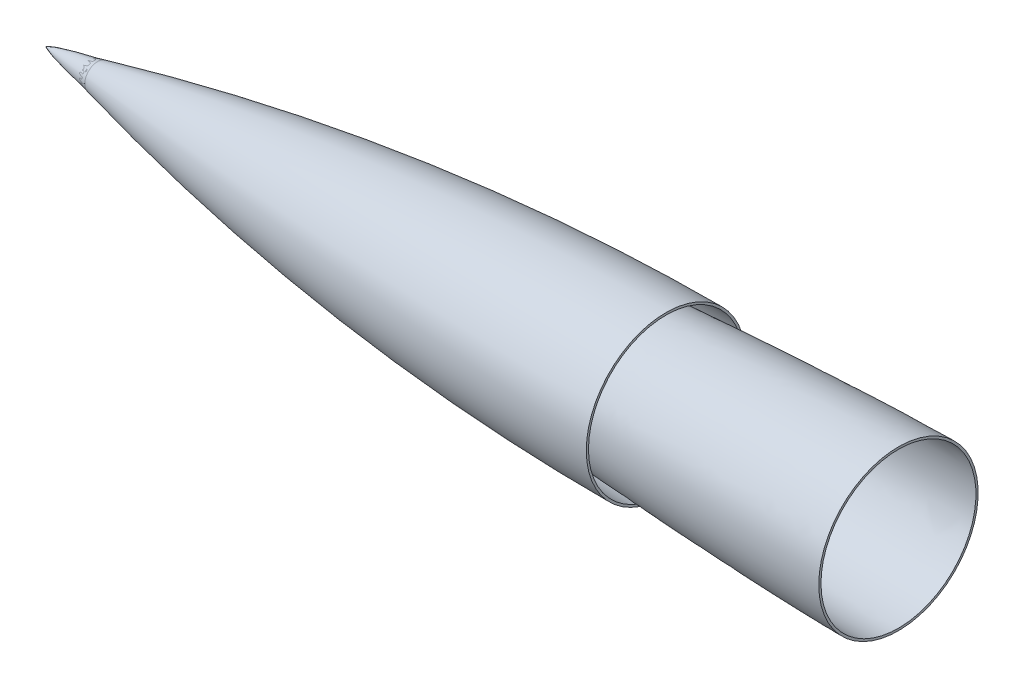
ISO-10303-21;
HEADER;
FILE_DESCRIPTION(('STEP AP214'),'2;1');
FILE_NAME('part.step','',(''),(''),'','','');
FILE_SCHEMA(('AUTOMOTIVE_DESIGN { 1 0 10303 214 1 1 1 1 }'));
ENDSEC;
DATA;
#1=APPLICATION_CONTEXT('core data for automotive mechanical design processes');
#2=APPLICATION_PROTOCOL_DEFINITION('international standard','automotive_design',2000,#1);
#3=PRODUCT_CONTEXT('',#1,'mechanical');
#4=PRODUCT('Part','Part','',(#3));
#5=PRODUCT_RELATED_PRODUCT_CATEGORY('part','',(#4));
#6=PRODUCT_DEFINITION_FORMATION('','',#4);
#7=PRODUCT_DEFINITION_CONTEXT('part definition',#1,'design');
#8=PRODUCT_DEFINITION('design','',#6,#7);
#9=PRODUCT_DEFINITION_SHAPE('','',#8);
#10=(LENGTH_UNIT() NAMED_UNIT(*) SI_UNIT(.MILLI.,.METRE.));
#11=(NAMED_UNIT(*) PLANE_ANGLE_UNIT() SI_UNIT($,.RADIAN.));
#12=(NAMED_UNIT(*) SI_UNIT($,.STERADIAN.) SOLID_ANGLE_UNIT());
#13=UNCERTAINTY_MEASURE_WITH_UNIT(LENGTH_MEASURE(1.E-05),#10,'distance_accuracy_value','');
#14=(GEOMETRIC_REPRESENTATION_CONTEXT(3) GLOBAL_UNCERTAINTY_ASSIGNED_CONTEXT((#13)) GLOBAL_UNIT_ASSIGNED_CONTEXT((#10,
#11,#12)) REPRESENTATION_CONTEXT('',''));
#15=CARTESIAN_POINT('',(0.,0.,0.));
#16=DIRECTION('',(0.,0.,1.));
#17=DIRECTION('',(1.,0.,0.));
#18=AXIS2_PLACEMENT_3D('',#15,#16,#17);
#19=CARTESIAN_POINT('',(0.,0.,0.));
#20=CARTESIAN_POINT('',(0.00317702909937878,0.00805840958692676,0.));
#21=CARTESIAN_POINT('',(0.010800135847234,0.0234223769034559,0.));
#22=CARTESIAN_POINT('',(0.0314929252234026,0.0509598185806805,0.));
#23=CARTESIAN_POINT('',(0.0675854254479373,0.0879761979560777,0.));
#24=CARTESIAN_POINT('',(0.112204828893876,0.128191749587115,0.));
#25=CARTESIAN_POINT('',(0.179388578355538,0.181798891329372,0.));
#26=CARTESIAN_POINT('',(0.263026627122997,0.242012948918516,0.));
#27=CARTESIAN_POINT('',(0.38669593286423,0.32321137414296,0.));
#28=CARTESIAN_POINT('',(0.552359905902535,0.421782181710066,0.));
#29=CARTESIAN_POINT('',(0.746788828228991,0.528198779960155,0.));
#30=CARTESIAN_POINT('',(0.970027425528134,0.641822831139472,0.));
#31=CARTESIAN_POINT('',(1.21695513961995,0.760525223145552,0.));
#32=CARTESIAN_POINT('',(1.48762491646403,0.883873786318492,0.));
#33=CARTESIAN_POINT('',(1.93656529095785,1.0789118896102,0.));
#34=CARTESIAN_POINT('',(2.73470171428864,1.40094066657572,0.));
#35=CARTESIAN_POINT('',(4.1808586252646,1.93080920135225,0.));
#36=CARTESIAN_POINT('',(6.9245260511524,2.82287080078171,0.));
#37=CARTESIAN_POINT('',(11.9500515080324,4.25343196476072,0.));
#38=CARTESIAN_POINT('',(21.3635599544039,6.57356765562803,0.));
#39=CARTESIAN_POINT('',(37.9699370546112,10.0848567598517,0.));
#40=CARTESIAN_POINT('',(65.9833222350669,15.1728033127659,0.));
#41=CARTESIAN_POINT('',(104.323332881786,21.159627913985,0.));
#42=CARTESIAN_POINT('',(150.713014803219,27.5461801921659,0.));
#43=CARTESIAN_POINT('',(202.035698960564,33.8804320225179,0.));
#44=CARTESIAN_POINT('',(253.4221944083,39.6690104685285,0.));
#45=CARTESIAN_POINT('',(304.857652562004,45.0039714268262,0.));
#46=CARTESIAN_POINT('',(356.332372092093,49.9438985143677,0.));
#47=CARTESIAN_POINT('',(407.840378372473,54.5234748897456,0.));
#48=CARTESIAN_POINT('',(459.377316478994,58.7643552200434,0.));
#49=CARTESIAN_POINT('',(510.940251572716,62.6765407854203,0.));
#50=CARTESIAN_POINT('',(562.526991673821,66.2611645216355,0.));
#51=CARTESIAN_POINT('',(614.136042687334,69.5093528781669,0.));
#52=CARTESIAN_POINT('',(665.766366997227,72.4008643657353,0.));
#53=CARTESIAN_POINT('',(710.961008697401,74.58590847622,0.));
#54=CARTESIAN_POINT('',(749.712093242931,76.1704730633879,0.));
#55=CARTESIAN_POINT('',(780.958904498785,77.2203745917417,0.));
#56=CARTESIAN_POINT('',(801.992198021446,77.7946682406497,0.));
#57=CARTESIAN_POINT('',(819.270146254875,78.1549953394653,0.));
#58=CARTESIAN_POINT('',(830.086879051757,78.3048958631373,0.));
#59=CARTESIAN_POINT('',(835.495571318975,78.3527214276436,0.));
#60=CARTESIAN_POINT('',(838.2,78.359,0.));
#61=B_SPLINE_CURVE_WITH_KNOTS('',4,(#19,#20,#21,#22,#23,#24,#25,#26,#27,#28,#29,#30,#31,#32,#33,
#34,#35,#36,#37,#38,#39,#40,#41,#42,#43,#44,#45,#46,#47,#48,#49,#50,#51,#52,#53,#54,#55,#56,#57,
#58,#59,#60),.UNSPECIFIED.,.F.,.F.,(5,1,1,1,1,1,1,1,1,1,1,1,1,1,1,1,1,1,1,1,1,1,1,1,1,1,1,1,1,1,
1,1,1,1,1,1,1,1,5),(0.,4.07377102222021E-05,8.14754204444041E-05,0.000162950840888808,
0.000244426261333212,0.000325901681777617,0.000488852522666425,0.000651803363555233,
0.000946002958988325,0.00124020255442142,0.00154012410145683,0.00184004564849225,
0.002245657542348,0.00265126943620374,0.00386207437272691,0.00592249854858952,
0.00955078345571665,0.0163352288071881,0.028645390048923,0.0519087345605002,0.090061820642701,
0.151391688465997,0.212721561063201,0.274051432755696,0.335381304488294,0.396711176279518,
0.458041048043663,0.51937091969532,0.580700792085993,0.642030664654617,0.703360536908367,
0.764690408781584,0.826020280670564,0.887350153395376,0.918015089455102,0.948680025514827,
0.974340012757414,0.987170006378707,1.),.UNSPECIFIED.);
#62=CARTESIAN_POINT('',(0.,0.,0.));
#63=DIRECTION('',(-1.,0.,0.));
#64=AXIS1_PLACEMENT('',#62,#63);
#65=SURFACE_OF_REVOLUTION('',#61,#64);
#66=CARTESIAN_POINT('',(50.8000000000001,0.,0.));
#67=DIRECTION('',(-1.,0.,0.));
#68=DIRECTION('',(0.,0.,1.));
#69=AXIS2_PLACEMENT_3D('',#66,#67,#68);
#70=CIRCLE('',#69,12.3559339427484);
#71=CARTESIAN_POINT('',(50.8000000000001,0.,12.3559339427484));
#72=VERTEX_POINT('',#71);
#73=EDGE_CURVE('E12',#72,#72,#70,.T.);
#74=ORIENTED_EDGE('',*,*,#73,.T.);
#75=EDGE_LOOP('',(#74));
#76=FACE_BOUND('',#75,.T.);
#77=CARTESIAN_POINT('',(0.,0.,0.));
#78=VERTEX_POINT('',#77);
#79=VERTEX_LOOP('',#78);
#80=FACE_BOUND('',#79,.T.);
#81=ADVANCED_FACE('F51',(#76,#80),#65,.F.);
#82=CARTESIAN_POINT('',(50.8000000000001,-2.2822770788629E-13,0.));
#83=DIRECTION('',(-1.,0.,0.));
#84=DIRECTION('',(0.,0.,1.));
#85=AXIS2_PLACEMENT_3D('',#82,#83,#84);
#86=PLANE('',#85);
#87=ORIENTED_EDGE('',*,*,#73,.F.);
#88=EDGE_LOOP('',(#87));
#89=FACE_BOUND('',#88,.T.);
#90=ADVANCED_FACE('F60',(#89),#86,.F.);
#91=CLOSED_SHELL('',(#81,#90));
#92=MANIFOLD_SOLID_BREP('B2',#91);
#93=CARTESIAN_POINT('',(0.,0.,0.));
#94=CARTESIAN_POINT('',(0.00317702909937878,0.00805840958692676,0.));
#95=CARTESIAN_POINT('',(0.010800135847234,0.0234223769034559,0.));
#96=CARTESIAN_POINT('',(0.0314929252234026,0.0509598185806805,0.));
#97=CARTESIAN_POINT('',(0.0675854254479373,0.0879761979560777,0.));
#98=CARTESIAN_POINT('',(0.112204828893876,0.128191749587115,0.));
#99=CARTESIAN_POINT('',(0.179388578355538,0.181798891329372,0.));
#100=CARTESIAN_POINT('',(0.263026627122997,0.242012948918516,0.));
#101=CARTESIAN_POINT('',(0.38669593286423,0.32321137414296,0.));
#102=CARTESIAN_POINT('',(0.552359905902535,0.421782181710066,0.));
#103=CARTESIAN_POINT('',(0.746788828228991,0.528198779960155,0.));
#104=CARTESIAN_POINT('',(0.970027425528134,0.641822831139472,0.));
#105=CARTESIAN_POINT('',(1.21695513961995,0.760525223145552,0.));
#106=CARTESIAN_POINT('',(1.48762491646403,0.883873786318492,0.));
#107=CARTESIAN_POINT('',(1.93656529095785,1.0789118896102,0.));
#108=CARTESIAN_POINT('',(2.73470171428864,1.40094066657572,0.));
#109=CARTESIAN_POINT('',(4.1808586252646,1.93080920135225,0.));
#110=CARTESIAN_POINT('',(6.9245260511524,2.82287080078171,0.));
#111=CARTESIAN_POINT('',(11.9500515080324,4.25343196476072,0.));
#112=CARTESIAN_POINT('',(21.3635599544039,6.57356765562803,0.));
#113=CARTESIAN_POINT('',(37.9699370546112,10.0848567598517,0.));
#114=CARTESIAN_POINT('',(65.9833222350669,15.1728033127659,0.));
#115=CARTESIAN_POINT('',(104.323332881786,21.159627913985,0.));
#116=CARTESIAN_POINT('',(150.713014803219,27.5461801921659,0.));
#117=CARTESIAN_POINT('',(202.035698960564,33.8804320225179,0.));
#118=CARTESIAN_POINT('',(253.4221944083,39.6690104685285,0.));
#119=CARTESIAN_POINT('',(304.857652562004,45.0039714268262,0.));
#120=CARTESIAN_POINT('',(356.332372092093,49.9438985143677,0.));
#121=CARTESIAN_POINT('',(407.840378372473,54.5234748897456,0.));
#122=CARTESIAN_POINT('',(459.377316478994,58.7643552200434,0.));
#123=CARTESIAN_POINT('',(510.940251572716,62.6765407854203,0.));
#124=CARTESIAN_POINT('',(562.526991673821,66.2611645216355,0.));
#125=CARTESIAN_POINT('',(614.136042687334,69.5093528781669,0.));
#126=CARTESIAN_POINT('',(665.766366997227,72.4008643657353,0.));
#127=CARTESIAN_POINT('',(710.961008697401,74.58590847622,0.));
#128=CARTESIAN_POINT('',(749.712093242931,76.1704730633879,0.));
#129=CARTESIAN_POINT('',(780.958904498785,77.2203745917417,0.));
#130=CARTESIAN_POINT('',(801.992198021446,77.7946682406497,0.));
#131=CARTESIAN_POINT('',(819.270146254875,78.1549953394653,0.));
#132=CARTESIAN_POINT('',(830.086879051757,78.3048958631373,0.));
#133=CARTESIAN_POINT('',(835.495571318975,78.3527214276436,0.));
#134=CARTESIAN_POINT('',(838.2,78.359,0.));
#135=B_SPLINE_CURVE_WITH_KNOTS('',4,(#93,#94,#95,#96,#97,#98,#99,#100,#101,#102,#103,#104,#105,
#106,#107,#108,#109,#110,#111,#112,#113,#114,#115,#116,#117,#118,#119,#120,#121,#122,#123,#124,
#125,#126,#127,#128,#129,#130,#131,#132,#133,#134),.UNSPECIFIED.,.F.,.F.,(5,1,1,1,1,1,1,1,1,1,1,
1,1,1,1,1,1,1,1,1,1,1,1,1,1,1,1,1,1,1,1,1,1,1,1,1,1,1,5),(0.,4.07377102222021E-05,
8.14754204444041E-05,0.000162950840888808,0.000244426261333212,0.000325901681777617,
0.000488852522666425,0.000651803363555233,0.000946002958988325,0.00124020255442142,
0.00154012410145683,0.00184004564849225,0.002245657542348,0.00265126943620374,
0.00386207437272691,0.00592249854858952,0.00955078345571665,0.0163352288071881,
0.028645390048923,0.0519087345605002,0.090061820642701,0.151391688465997,0.212721561063201,
0.274051432755696,0.335381304488294,0.396711176279518,0.458041048043663,0.51937091969532,
0.580700792085993,0.642030664654617,0.703360536908367,0.764690408781584,0.826020280670564,
0.887350153395376,0.918015089455102,0.948680025514827,0.974340012757414,0.987170006378707,1.),.UNSPECIFIED.);
#136=CARTESIAN_POINT('',(0.,0.,0.));
#137=DIRECTION('',(-1.,0.,0.));
#138=AXIS1_PLACEMENT('',#136,#137);
#139=SURFACE_OF_REVOLUTION('',#135,#138);
#140=CARTESIAN_POINT('',(838.2,0.,0.));
#141=DIRECTION('',(-1.,0.,0.));
#142=DIRECTION('',(0.,0.,1.));
#143=AXIS2_PLACEMENT_3D('',#140,#141,#142);
#144=CIRCLE('',#143,78.359);
#145=CARTESIAN_POINT('',(838.2,0.,78.359));
#146=VERTEX_POINT('',#145);
#147=EDGE_CURVE('E102',#146,#146,#144,.T.);
#148=ORIENTED_EDGE('',*,*,#147,.T.);
#149=EDGE_LOOP('',(#148));
#150=FACE_BOUND('',#149,.T.);
#151=CARTESIAN_POINT('',(50.8000000000001,0.,0.));
#152=DIRECTION('',(-1.,0.,0.));
#153=DIRECTION('',(0.,0.,1.));
#154=AXIS2_PLACEMENT_3D('',#151,#152,#153);
#155=CIRCLE('',#154,12.3559339427484);
#156=CARTESIAN_POINT('',(50.8000000000001,0.,12.3559339427484));
#157=VERTEX_POINT('',#156);
#158=EDGE_CURVE('E50',#157,#157,#155,.T.);
#159=ORIENTED_EDGE('',*,*,#158,.F.);
#160=EDGE_LOOP('',(#159));
#161=FACE_BOUND('',#160,.T.);
#162=ADVANCED_FACE('F95',(#150,#161),#139,.F.);
#163=CARTESIAN_POINT('',(50.8000000000001,-2.2822770788629E-13,0.));
#164=DIRECTION('',(-1.,0.,0.));
#165=DIRECTION('',(0.,0.,1.));
#166=AXIS2_PLACEMENT_3D('',#163,#164,#165);
#167=PLANE('',#166);
#168=CARTESIAN_POINT('',(50.8000000000001,0.,0.));
#169=DIRECTION('',(-1.,0.,0.));
#170=DIRECTION('',(0.,0.,1.));
#171=AXIS2_PLACEMENT_3D('',#168,#169,#170);
#172=CIRCLE('',#171,10.1621917274797);
#173=CARTESIAN_POINT('',(50.8000000000001,0.,10.1621917274797));
#174=VERTEX_POINT('',#173);
#175=EDGE_CURVE('E106',#174,#174,#172,.T.);
#176=ORIENTED_EDGE('',*,*,#175,.F.);
#177=EDGE_LOOP('',(#176));
#178=FACE_BOUND('',#177,.T.);
#179=ORIENTED_EDGE('',*,*,#158,.T.);
#180=EDGE_LOOP('',(#179));
#181=FACE_BOUND('',#180,.T.);
#182=ADVANCED_FACE('F133',(#178,#181),#167,.T.);
#183=CARTESIAN_POINT('',(838.2,0.,0.));
#184=DIRECTION('',(1.,0.,0.));
#185=DIRECTION('',(0.,0.,-1.));
#186=AXIS2_PLACEMENT_3D('',#183,#184,#185);
#187=PLANE('',#186);
#188=CARTESIAN_POINT('',(838.2,0.,0.));
#189=DIRECTION('',(-1.,0.,0.));
#190=DIRECTION('',(0.,0.,1.));
#191=AXIS2_PLACEMENT_3D('',#188,#189,#190);
#192=CIRCLE('',#191,76.1999941589445);
#193=CARTESIAN_POINT('',(838.2,0.,76.1999941589445));
#194=VERTEX_POINT('',#193);
#195=EDGE_CURVE('E110',#194,#194,#192,.T.);
#196=ORIENTED_EDGE('',*,*,#195,.T.);
#197=EDGE_LOOP('',(#196));
#198=FACE_BOUND('',#197,.T.);
#199=ORIENTED_EDGE('',*,*,#147,.F.);
#200=EDGE_LOOP('',(#199));
#201=FACE_BOUND('',#200,.T.);
#202=ADVANCED_FACE('F131',(#198,#201),#187,.T.);
#203=CARTESIAN_POINT('',(43.0180135781087,10.9542565991187,0.));
#204=CARTESIAN_POINT('',(44.9635101835816,11.3046759350261,0.));
#205=CARTESIAN_POINT('',(46.9090067890544,11.6550952709336,0.));
#206=CARTESIAN_POINT('',(48.8545033945273,12.005514606841,0.));
#207=CARTESIAN_POINT('',(56.5821574644969,13.3974057053417,0.));
#208=CARTESIAN_POINT('',(75.1116358512064,16.5956608481428,0.));
#209=CARTESIAN_POINT('',(106.470228327575,21.4551949330376,0.));
#210=CARTESIAN_POINT('',(150.713014803219,27.5461801921659,0.));
#211=CARTESIAN_POINT('',(202.035698960564,33.8804320225179,0.));
#212=CARTESIAN_POINT('',(253.4221944083,39.6690104685285,0.));
#213=CARTESIAN_POINT('',(304.857652562004,45.0039714268262,0.));
#214=CARTESIAN_POINT('',(356.332372092093,49.9438985143677,0.));
#215=CARTESIAN_POINT('',(407.840378372473,54.5234748897456,0.));
#216=CARTESIAN_POINT('',(459.377316478994,58.7643552200434,0.));
#217=CARTESIAN_POINT('',(510.940251572716,62.6765407854203,0.));
#218=CARTESIAN_POINT('',(562.526991673821,66.2611645216355,0.));
#219=CARTESIAN_POINT('',(614.136042687334,69.5093528781669,0.));
#220=CARTESIAN_POINT('',(665.766366997227,72.4008643657353,0.));
#221=CARTESIAN_POINT('',(710.961008697401,74.58590847622,0.));
#222=CARTESIAN_POINT('',(749.712093242931,76.1704730633879,0.));
#223=CARTESIAN_POINT('',(780.958904498785,77.2203745917417,0.));
#224=CARTESIAN_POINT('',(801.992198021446,77.7946682406497,0.));
#225=CARTESIAN_POINT('',(819.270146254875,78.1549953394653,0.));
#226=CARTESIAN_POINT('',(830.086879051757,78.3048958631373,0.));
#227=CARTESIAN_POINT('',(835.495571318975,78.3527214276436,0.));
#228=CARTESIAN_POINT('',(838.2,78.359,0.));
#229=B_SPLINE_CURVE_WITH_KNOTS('',4,(#203,#204,#205,#206,#207,#208,#209,#210,#211,#212,#213,
#214,#215,#216,#217,#218,#219,#220,#221,#222,#223,#224,#225,#226,#227,#228),.UNSPECIFIED.,.F.,
.F.,(5,3,1,1,1,1,1,1,1,1,1,1,1,1,1,1,1,1,1,1,5),(0.0528113015634331,0.0621894074885476,
0.090061820642701,0.151391688465997,0.212721561063201,0.274051432755696,0.335381304488294,
0.396711176279518,0.458041048043663,0.51937091969532,0.580700792085993,0.642030664654617,
0.703360536908367,0.764690408781584,0.826020280670564,0.887350153395376,0.918015089455102,
0.948680025514827,0.974340012757414,0.987170006378707,1.),.UNSPECIFIED.);
#230=CARTESIAN_POINT('',(0.,0.,0.));
#231=DIRECTION('',(-1.,0.,0.));
#232=AXIS1_PLACEMENT('',#230,#231);
#233=SURFACE_OF_REVOLUTION('',#229,#232);
#234=OFFSET_SURFACE('',#233,2.159,.F.);
#235=ORIENTED_EDGE('',*,*,#195,.F.);
#236=EDGE_LOOP('',(#235));
#237=FACE_BOUND('',#236,.T.);
#238=ORIENTED_EDGE('',*,*,#175,.T.);
#239=EDGE_LOOP('',(#238));
#240=FACE_BOUND('',#239,.T.);
#241=ADVANCED_FACE('F130',(#237,#240),#234,.T.);
#242=CLOSED_SHELL('',(#162,#182,#202,#241));
#243=MANIFOLD_SOLID_BREP('B6',#242);
#244=CARTESIAN_POINT('',(50.8,1.66646179039321E-13,0.));
#245=DIRECTION('',(-1.,0.,0.));
#246=DIRECTION('',(0.,0.,1.));
#247=AXIS2_PLACEMENT_3D('',#244,#245,#246);
#248=PLANE('',#247);
#249=CARTESIAN_POINT('',(50.8,0.,0.));
#250=DIRECTION('',(-1.,0.,0.));
#251=DIRECTION('',(0.,0.,1.));
#252=AXIS2_PLACEMENT_3D('',#249,#250,#251);
#253=CIRCLE('',#252,12.6914092726476);
#254=CARTESIAN_POINT('',(50.8,0.,12.6914092726476));
#255=VERTEX_POINT('',#254);
#256=EDGE_CURVE('E93',#255,#255,#253,.T.);
#257=ORIENTED_EDGE('',*,*,#256,.F.);
#258=EDGE_LOOP('',(#257));
#259=FACE_BOUND('',#258,.T.);
#260=ADVANCED_FACE('F179',(#259),#248,.F.);
#261=CARTESIAN_POINT('',(609.6,0.,-2332.03605915721));
#262=DIRECTION('',(0.,-1.,0.));
#263=DIRECTION('',(0.,0.,1.));
#264=AXIS2_PLACEMENT_3D('',#261,#262,#263);
#265=CIRCLE('',#264,2410.39505915721);
#266=TRIMMED_CURVE('',#265,(PARAMETER_VALUE(-0.255681281054047)),
(PARAMETER_VALUE(0.255681281054047)),.T.,.PARAMETER.);
#267=CARTESIAN_POINT('',(609.6,0.,0.));
#268=DIRECTION('',(-1.,0.,0.));
#269=AXIS1_PLACEMENT('',#267,#268);
#270=SURFACE_OF_REVOLUTION('',#266,#269);
#271=CARTESIAN_POINT('',(0.,0.,0.));
#272=VERTEX_POINT('',#271);
#273=VERTEX_LOOP('',#272);
#274=FACE_BOUND('',#273,.T.);
#275=ORIENTED_EDGE('',*,*,#256,.T.);
#276=EDGE_LOOP('',(#275));
#277=FACE_BOUND('',#276,.T.);
#278=ADVANCED_FACE('F186',(#274,#277),#270,.T.);
#279=CLOSED_SHELL('',(#260,#278));
#280=MANIFOLD_SOLID_BREP('B45',#279);
#281=CARTESIAN_POINT('',(609.6,0.,0.));
#282=DIRECTION('',(-1.,0.,0.));
#283=DIRECTION('',(0.,0.,1.));
#284=AXIS2_PLACEMENT_3D('',#281,#282,#283);
#285=PLANE('',#284);
#286=CARTESIAN_POINT('',(609.6,0.,0.));
#287=DIRECTION('',(-1.,0.,0.));
#288=DIRECTION('',(0.,0.,1.));
#289=AXIS2_PLACEMENT_3D('',#286,#287,#288);
#290=CIRCLE('',#289,76.2);
#291=CARTESIAN_POINT('',(609.6,0.,76.2));
#292=VERTEX_POINT('',#291);
#293=EDGE_CURVE('E216',#292,#292,#290,.T.);
#294=ORIENTED_EDGE('',*,*,#293,.T.);
#295=EDGE_LOOP('',(#294));
#296=FACE_BOUND('',#295,.T.);
#297=CARTESIAN_POINT('',(609.6,0.,0.));
#298=DIRECTION('',(-1.,0.,0.));
#299=DIRECTION('',(0.,0.,1.));
#300=AXIS2_PLACEMENT_3D('',#297,#298,#299);
#301=CIRCLE('',#300,78.359);
#302=CARTESIAN_POINT('',(609.6,0.,78.359));
#303=VERTEX_POINT('',#302);
#304=EDGE_CURVE('E178',#303,#303,#301,.T.);
#305=ORIENTED_EDGE('',*,*,#304,.F.);
#306=EDGE_LOOP('',(#305));
#307=FACE_BOUND('',#306,.T.);
#308=ADVANCED_FACE('F206',(#296,#307),#285,.F.);
#309=CARTESIAN_POINT('',(609.6,0.,0.));
#310=DIRECTION('',(-1.,0.,0.));
#311=DIRECTION('',(0.,0.,1.));
#312=AXIS2_PLACEMENT_3D('',#309,#310,#311);
#313=DEGENERATE_TOROIDAL_SURFACE('',#312,2332.03605915721,2410.39505915721,.F.);
#314=CARTESIAN_POINT('',(50.8,0.,0.));
#315=DIRECTION('',(-1.,0.,0.));
#316=DIRECTION('',(0.,0.,1.));
#317=AXIS2_PLACEMENT_3D('',#314,#315,#316);
#318=CIRCLE('',#317,12.6914092726476);
#319=CARTESIAN_POINT('',(50.8,0.,12.6914092726476));
#320=VERTEX_POINT('',#319);
#321=EDGE_CURVE('E212',#320,#320,#318,.T.);
#322=ORIENTED_EDGE('',*,*,#321,.F.);
#323=EDGE_LOOP('',(#322));
#324=FACE_BOUND('',#323,.T.);
#325=ORIENTED_EDGE('',*,*,#304,.T.);
#326=EDGE_LOOP('',(#325));
#327=FACE_BOUND('',#326,.T.);
#328=ADVANCED_FACE('F231',(#324,#327),#313,.F.);
#329=CARTESIAN_POINT('',(50.8,1.66646179039321E-13,0.));
#330=DIRECTION('',(-1.,0.,0.));
#331=DIRECTION('',(0.,0.,1.));
#332=AXIS2_PLACEMENT_3D('',#329,#330,#331);
#333=PLANE('',#332);
#334=CARTESIAN_POINT('',(50.8,0.,0.));
#335=DIRECTION('',(-1.,0.,0.));
#336=DIRECTION('',(0.,0.,1.));
#337=AXIS2_PLACEMENT_3D('',#334,#335,#336);
#338=CIRCLE('',#337,10.4718867471467);
#339=CARTESIAN_POINT('',(50.8,0.,10.4718867471467));
#340=VERTEX_POINT('',#339);
#341=EDGE_CURVE('E220',#340,#340,#338,.T.);
#342=ORIENTED_EDGE('',*,*,#341,.F.);
#343=EDGE_LOOP('',(#342));
#344=FACE_BOUND('',#343,.T.);
#345=ORIENTED_EDGE('',*,*,#321,.T.);
#346=EDGE_LOOP('',(#345));
#347=FACE_BOUND('',#346,.T.);
#348=ADVANCED_FACE('F229',(#344,#347),#333,.T.);
#349=CARTESIAN_POINT('',(609.6,0.,0.));
#350=DIRECTION('',(-1.,0.,0.));
#351=DIRECTION('',(0.,0.,1.));
#352=AXIS2_PLACEMENT_3D('',#349,#350,#351);
#353=DEGENERATE_TOROIDAL_SURFACE('',#352,2332.03605915721,2408.23605915721,.F.);
#354=ORIENTED_EDGE('',*,*,#341,.T.);
#355=EDGE_LOOP('',(#354));
#356=FACE_BOUND('',#355,.T.);
#357=ORIENTED_EDGE('',*,*,#293,.F.);
#358=EDGE_LOOP('',(#357));
#359=FACE_BOUND('',#358,.T.);
#360=ADVANCED_FACE('F226',(#356,#359),#353,.T.);
#361=CLOSED_SHELL('',(#308,#328,#348,#360));
#362=MANIFOLD_SOLID_BREP('B87',#361);
#363=ADVANCED_BREP_SHAPE_REPRESENTATION('',(#18,#92,#243,#280,#362),#14);
#364=SHAPE_DEFINITION_REPRESENTATION(#9,#363);
ENDSEC;
END-ISO-10303-21;
